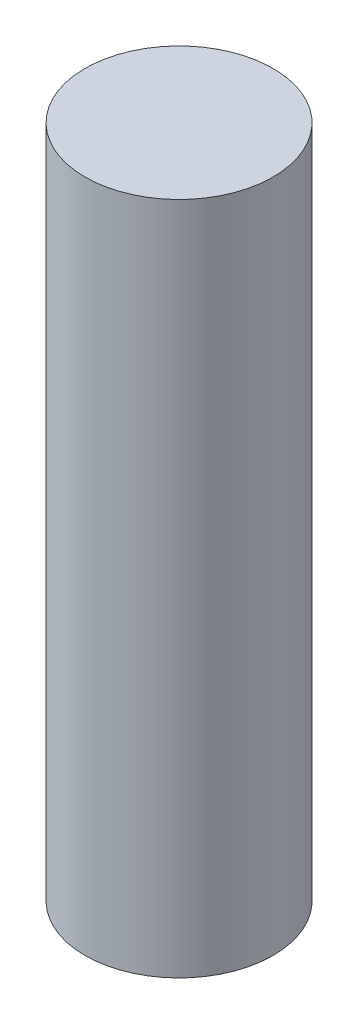
ISO-10303-21;
HEADER;
FILE_DESCRIPTION(('STEP AP214'),'2;1');
FILE_NAME('part.step','',(''),(''),'','','');
FILE_SCHEMA(('AUTOMOTIVE_DESIGN { 1 0 10303 214 1 1 1 1 }'));
ENDSEC;
DATA;
#1=APPLICATION_CONTEXT('core data for automotive mechanical design processes');
#2=APPLICATION_PROTOCOL_DEFINITION('international standard','automotive_design',2000,#1);
#3=PRODUCT_CONTEXT('',#1,'mechanical');
#4=PRODUCT('Part','Part','',(#3));
#5=PRODUCT_RELATED_PRODUCT_CATEGORY('part','',(#4));
#6=PRODUCT_DEFINITION_FORMATION('','',#4);
#7=PRODUCT_DEFINITION_CONTEXT('part definition',#1,'design');
#8=PRODUCT_DEFINITION('design','',#6,#7);
#9=PRODUCT_DEFINITION_SHAPE('','',#8);
#10=(LENGTH_UNIT() NAMED_UNIT(*) SI_UNIT(.MILLI.,.METRE.));
#11=(NAMED_UNIT(*) PLANE_ANGLE_UNIT() SI_UNIT($,.RADIAN.));
#12=(NAMED_UNIT(*) SI_UNIT($,.STERADIAN.) SOLID_ANGLE_UNIT());
#13=UNCERTAINTY_MEASURE_WITH_UNIT(LENGTH_MEASURE(1.E-05),#10,'distance_accuracy_value','');
#14=(GEOMETRIC_REPRESENTATION_CONTEXT(3) GLOBAL_UNCERTAINTY_ASSIGNED_CONTEXT((#13)) GLOBAL_UNIT_ASSIGNED_CONTEXT((#10,
#11,#12)) REPRESENTATION_CONTEXT('',''));
#15=CARTESIAN_POINT('',(0.,0.,0.));
#16=DIRECTION('',(0.,0.,1.));
#17=DIRECTION('',(1.,0.,0.));
#18=AXIS2_PLACEMENT_3D('',#15,#16,#17);
#19=CARTESIAN_POINT('',(0.,51.435,0.));
#20=DIRECTION('',(0.,-1.,0.));
#21=DIRECTION('',(0.,0.,-1.));
#22=AXIS2_PLACEMENT_3D('',#19,#20,#21);
#23=CYLINDRICAL_SURFACE('',#22,7.1755);
#24=CARTESIAN_POINT('',(0.,51.435,0.));
#25=DIRECTION('',(0.,1.,0.));
#26=DIRECTION('',(0.,0.,1.));
#27=AXIS2_PLACEMENT_3D('',#24,#25,#26);
#28=CIRCLE('',#27,7.1755);
#29=CARTESIAN_POINT('',(0.,51.435,7.1755));
#30=VERTEX_POINT('',#29);
#31=EDGE_CURVE('E10',#30,#30,#28,.T.);
#32=ORIENTED_EDGE('',*,*,#31,.F.);
#33=EDGE_LOOP('',(#32));
#34=FACE_BOUND('',#33,.T.);
#35=CARTESIAN_POINT('',(0.,0.,0.));
#36=DIRECTION('',(0.,1.,0.));
#37=DIRECTION('',(0.,0.,1.));
#38=AXIS2_PLACEMENT_3D('',#35,#36,#37);
#39=CIRCLE('',#38,7.1755);
#40=CARTESIAN_POINT('',(0.,0.,7.1755));
#41=VERTEX_POINT('',#40);
#42=EDGE_CURVE('E34',#41,#41,#39,.T.);
#43=ORIENTED_EDGE('',*,*,#42,.T.);
#44=EDGE_LOOP('',(#43));
#45=FACE_BOUND('',#44,.T.);
#46=ADVANCED_FACE('F31',(#34,#45),#23,.T.);
#47=CARTESIAN_POINT('',(0.,51.435,0.));
#48=DIRECTION('',(0.,1.,0.));
#49=DIRECTION('',(0.,0.,1.));
#50=AXIS2_PLACEMENT_3D('',#47,#48,#49);
#51=PLANE('',#50);
#52=ORIENTED_EDGE('',*,*,#31,.T.);
#53=EDGE_LOOP('',(#52));
#54=FACE_BOUND('',#53,.T.);
#55=ADVANCED_FACE('F46',(#54),#51,.T.);
#56=CARTESIAN_POINT('',(0.,0.,0.));
#57=DIRECTION('',(0.,1.,0.));
#58=DIRECTION('',(0.,0.,1.));
#59=AXIS2_PLACEMENT_3D('',#56,#57,#58);
#60=PLANE('',#59);
#61=ORIENTED_EDGE('',*,*,#42,.F.);
#62=EDGE_LOOP('',(#61));
#63=FACE_BOUND('',#62,.T.);
#64=ADVANCED_FACE('F44',(#63),#60,.F.);
#65=CLOSED_SHELL('',(#46,#55,#64));
#66=MANIFOLD_SOLID_BREP('B2',#65);
#67=ADVANCED_BREP_SHAPE_REPRESENTATION('',(#18,#66),#14);
#68=SHAPE_DEFINITION_REPRESENTATION(#9,#67);
ENDSEC;
END-ISO-10303-21;
